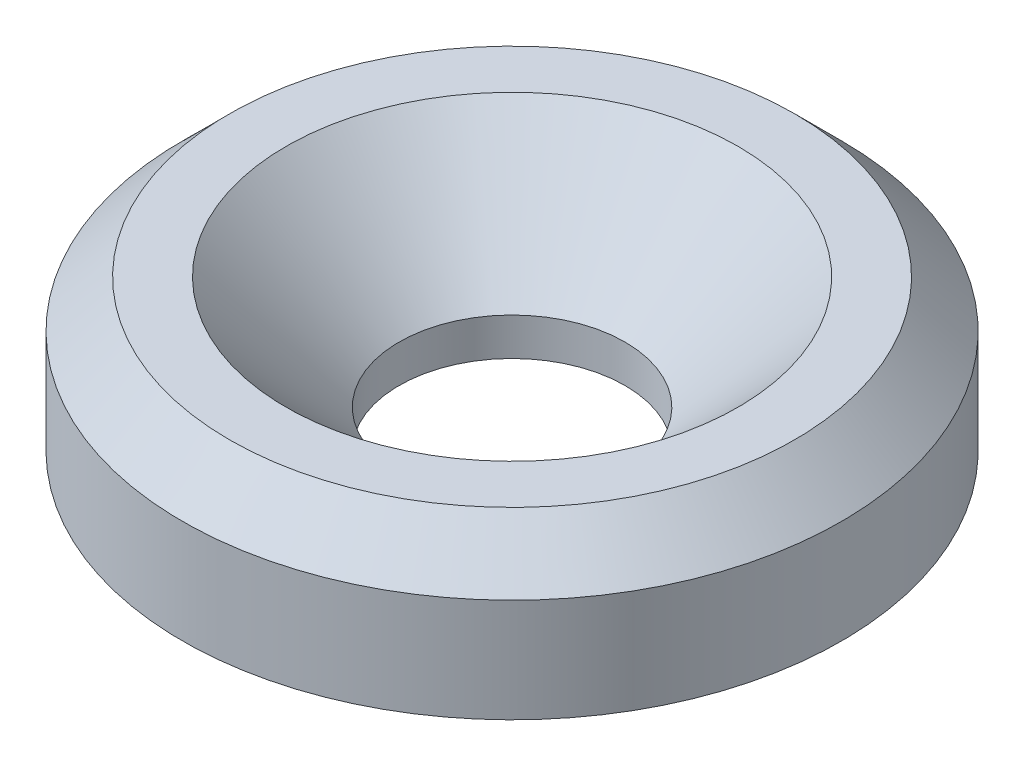
ISO-10303-21;
HEADER;
FILE_DESCRIPTION(('STEP AP214'),'2;1');
FILE_NAME('part.step','',(''),(''),'','','');
FILE_SCHEMA(('AUTOMOTIVE_DESIGN { 1 0 10303 214 1 1 1 1 }'));
ENDSEC;
DATA;
#1=APPLICATION_CONTEXT('core data for automotive mechanical design processes');
#2=APPLICATION_PROTOCOL_DEFINITION('international standard','automotive_design',2000,#1);
#3=PRODUCT_CONTEXT('',#1,'mechanical');
#4=PRODUCT('Part','Part','',(#3));
#5=PRODUCT_RELATED_PRODUCT_CATEGORY('part','',(#4));
#6=PRODUCT_DEFINITION_FORMATION('','',#4);
#7=PRODUCT_DEFINITION_CONTEXT('part definition',#1,'design');
#8=PRODUCT_DEFINITION('design','',#6,#7);
#9=PRODUCT_DEFINITION_SHAPE('','',#8);
#10=(LENGTH_UNIT() NAMED_UNIT(*) SI_UNIT(.MILLI.,.METRE.));
#11=(NAMED_UNIT(*) PLANE_ANGLE_UNIT() SI_UNIT($,.RADIAN.));
#12=(NAMED_UNIT(*) SI_UNIT($,.STERADIAN.) SOLID_ANGLE_UNIT());
#13=UNCERTAINTY_MEASURE_WITH_UNIT(LENGTH_MEASURE(1.E-05),#10,'distance_accuracy_value','');
#14=(GEOMETRIC_REPRESENTATION_CONTEXT(3) GLOBAL_UNCERTAINTY_ASSIGNED_CONTEXT((#13)) GLOBAL_UNIT_ASSIGNED_CONTEXT((#10,
#11,#12)) REPRESENTATION_CONTEXT('',''));
#15=CARTESIAN_POINT('',(0.,0.,0.));
#16=DIRECTION('',(0.,0.,1.));
#17=DIRECTION('',(1.,0.,0.));
#18=AXIS2_PLACEMENT_3D('',#15,#16,#17);
#19=CARTESIAN_POINT('',(-17.5,0.,0.));
#20=DIRECTION('',(0.,1.,0.));
#21=DIRECTION('',(0.,0.,1.));
#22=AXIS2_PLACEMENT_3D('',#19,#20,#21);
#23=PLANE('',#22);
#24=CARTESIAN_POINT('',(0.,0.,0.));
#25=DIRECTION('',(0.,-1.,0.));
#26=DIRECTION('',(0.,0.,-1.));
#27=AXIS2_PLACEMENT_3D('',#24,#25,#26);
#28=CIRCLE('',#27,6.);
#29=CARTESIAN_POINT('',(0.,0.,-6.));
#30=VERTEX_POINT('',#29);
#31=EDGE_CURVE('E51',#30,#30,#28,.T.);
#32=ORIENTED_EDGE('',*,*,#31,.F.);
#33=EDGE_LOOP('',(#32));
#34=FACE_BOUND('',#33,.T.);
#35=CARTESIAN_POINT('',(0.,0.,0.));
#36=DIRECTION('',(0.,-1.,0.));
#37=DIRECTION('',(0.,0.,-1.));
#38=AXIS2_PLACEMENT_3D('',#35,#36,#37);
#39=CIRCLE('',#38,17.5);
#40=CARTESIAN_POINT('',(0.,0.,-17.5));
#41=VERTEX_POINT('',#40);
#42=EDGE_CURVE('E65',#41,#41,#39,.T.);
#43=ORIENTED_EDGE('',*,*,#42,.T.);
#44=EDGE_LOOP('',(#43));
#45=FACE_BOUND('',#44,.T.);
#46=ADVANCED_FACE('F39',(#34,#45),#23,.F.);
#47=CARTESIAN_POINT('',(0.,0.,0.));
#48=DIRECTION('',(0.,-1.,0.));
#49=DIRECTION('',(0.,0.,-1.));
#50=AXIS2_PLACEMENT_3D('',#47,#48,#49);
#51=CYLINDRICAL_SURFACE('',#50,6.);
#52=CARTESIAN_POINT('',(0.,2.,0.));
#53=DIRECTION('',(0.,-1.,0.));
#54=DIRECTION('',(0.,0.,-1.));
#55=AXIS2_PLACEMENT_3D('',#52,#53,#54);
#56=CIRCLE('',#55,6.);
#57=CARTESIAN_POINT('',(0.,2.,-6.));
#58=VERTEX_POINT('',#57);
#59=EDGE_CURVE('E54',#58,#58,#56,.T.);
#60=ORIENTED_EDGE('',*,*,#59,.F.);
#61=EDGE_LOOP('',(#60));
#62=FACE_BOUND('',#61,.T.);
#63=ORIENTED_EDGE('',*,*,#31,.T.);
#64=EDGE_LOOP('',(#63));
#65=FACE_BOUND('',#64,.T.);
#66=ADVANCED_FACE('F79',(#62,#65),#51,.F.);
#67=CARTESIAN_POINT('',(0.,2.,0.));
#68=DIRECTION('',(0.,1.,0.));
#69=DIRECTION('',(0.,0.,1.));
#70=AXIS2_PLACEMENT_3D('',#67,#68,#69);
#71=CONICAL_SURFACE('',#70,6.,0.78539816339745);
#72=CARTESIAN_POINT('',(0.,8.,0.));
#73=DIRECTION('',(0.,-1.,0.));
#74=DIRECTION('',(0.,0.,-1.));
#75=AXIS2_PLACEMENT_3D('',#72,#73,#74);
#76=CIRCLE('',#75,12.);
#77=CARTESIAN_POINT('',(0.,8.,-12.));
#78=VERTEX_POINT('',#77);
#79=EDGE_CURVE('E58',#78,#78,#76,.T.);
#80=ORIENTED_EDGE('',*,*,#79,.F.);
#81=EDGE_LOOP('',(#80));
#82=FACE_BOUND('',#81,.T.);
#83=ORIENTED_EDGE('',*,*,#59,.T.);
#84=EDGE_LOOP('',(#83));
#85=FACE_BOUND('',#84,.T.);
#86=ADVANCED_FACE('F77',(#82,#85),#71,.F.);
#87=CARTESIAN_POINT('',(-12.,8.,0.));
#88=DIRECTION('',(0.,-1.,0.));
#89=DIRECTION('',(0.,0.,-1.));
#90=AXIS2_PLACEMENT_3D('',#87,#88,#89);
#91=PLANE('',#90);
#92=CARTESIAN_POINT('',(0.,8.,0.));
#93=DIRECTION('',(0.,-1.,0.));
#94=DIRECTION('',(0.,0.,-1.));
#95=AXIS2_PLACEMENT_3D('',#92,#93,#94);
#96=CIRCLE('',#95,15.);
#97=CARTESIAN_POINT('',(0.,8.,-15.));
#98=VERTEX_POINT('',#97);
#99=EDGE_CURVE('E10',#98,#98,#96,.F.);
#100=ORIENTED_EDGE('',*,*,#99,.T.);
#101=EDGE_LOOP('',(#100));
#102=FACE_BOUND('',#101,.T.);
#103=ORIENTED_EDGE('',*,*,#79,.T.);
#104=EDGE_LOOP('',(#103));
#105=FACE_BOUND('',#104,.T.);
#106=ADVANCED_FACE('F68',(#102,#105),#91,.F.);
#107=CARTESIAN_POINT('',(0.,0.,0.));
#108=DIRECTION('',(0.,-1.,0.));
#109=DIRECTION('',(0.,0.,-1.));
#110=AXIS2_PLACEMENT_3D('',#107,#108,#109);
#111=CYLINDRICAL_SURFACE('',#110,17.5);
#112=CARTESIAN_POINT('',(0.,5.50000000000001,0.));
#113=DIRECTION('',(0.,-1.,0.));
#114=DIRECTION('',(0.,0.,-1.));
#115=AXIS2_PLACEMENT_3D('',#112,#113,#114);
#116=CIRCLE('',#115,17.5);
#117=CARTESIAN_POINT('',(0.,5.50000000000001,-17.5));
#118=VERTEX_POINT('',#117);
#119=EDGE_CURVE('E50',#118,#118,#116,.T.);
#120=ORIENTED_EDGE('',*,*,#119,.T.);
#121=EDGE_LOOP('',(#120));
#122=FACE_BOUND('',#121,.T.);
#123=ORIENTED_EDGE('',*,*,#42,.F.);
#124=EDGE_LOOP('',(#123));
#125=FACE_BOUND('',#124,.T.);
#126=ADVANCED_FACE('F66',(#122,#125),#111,.T.);
#127=CARTESIAN_POINT('',(0.,5.50000000000001,0.));
#128=DIRECTION('',(0.,-1.,0.));
#129=DIRECTION('',(0.,0.,-1.));
#130=AXIS2_PLACEMENT_3D('',#127,#128,#129);
#131=CONICAL_SURFACE('',#130,17.5,0.78539816339745);
#132=ORIENTED_EDGE('',*,*,#99,.F.);
#133=EDGE_LOOP('',(#132));
#134=FACE_BOUND('',#133,.T.);
#135=ORIENTED_EDGE('',*,*,#119,.F.);
#136=EDGE_LOOP('',(#135));
#137=FACE_BOUND('',#136,.T.);
#138=ADVANCED_FACE('F45',(#134,#137),#131,.T.);
#139=CLOSED_SHELL('',(#46,#66,#86,#106,#126,#138));
#140=MANIFOLD_SOLID_BREP('B2',#139);
#141=ADVANCED_BREP_SHAPE_REPRESENTATION('',(#18,#140),#14);
#142=SHAPE_DEFINITION_REPRESENTATION(#9,#141);
ENDSEC;
END-ISO-10303-21;
